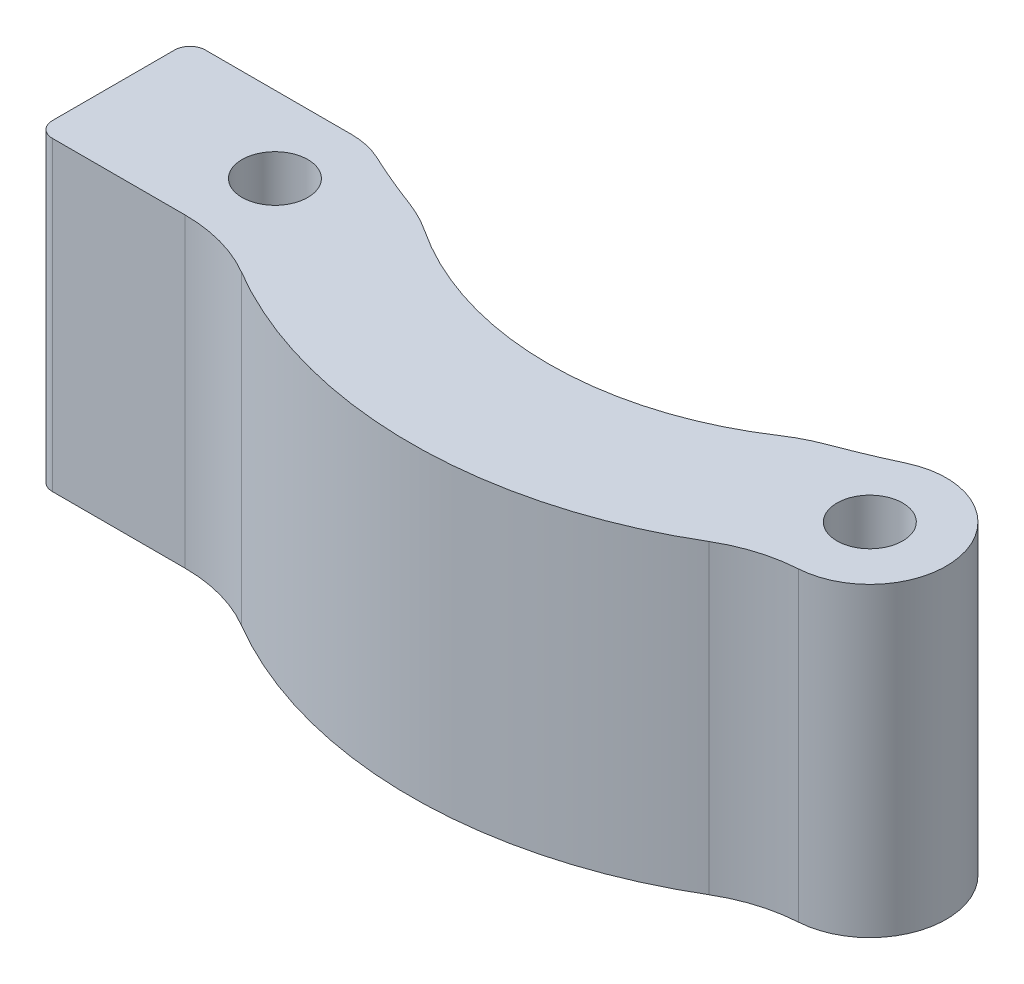
ISO-10303-21;
HEADER;
FILE_DESCRIPTION(('STEP AP214'),'2;1');
FILE_NAME('part.step','',(''),(''),'','','');
FILE_SCHEMA(('AUTOMOTIVE_DESIGN { 1 0 10303 214 1 1 1 1 }'));
ENDSEC;
DATA;
#1=APPLICATION_CONTEXT('core data for automotive mechanical design processes');
#2=APPLICATION_PROTOCOL_DEFINITION('international standard','automotive_design',2000,#1);
#3=PRODUCT_CONTEXT('',#1,'mechanical');
#4=PRODUCT('Part','Part','',(#3));
#5=PRODUCT_RELATED_PRODUCT_CATEGORY('part','',(#4));
#6=PRODUCT_DEFINITION_FORMATION('','',#4);
#7=PRODUCT_DEFINITION_CONTEXT('part definition',#1,'design');
#8=PRODUCT_DEFINITION('design','',#6,#7);
#9=PRODUCT_DEFINITION_SHAPE('','',#8);
#10=(LENGTH_UNIT() NAMED_UNIT(*) SI_UNIT(.MILLI.,.METRE.));
#11=(NAMED_UNIT(*) PLANE_ANGLE_UNIT() SI_UNIT($,.RADIAN.));
#12=(NAMED_UNIT(*) SI_UNIT($,.STERADIAN.) SOLID_ANGLE_UNIT());
#13=UNCERTAINTY_MEASURE_WITH_UNIT(LENGTH_MEASURE(1.E-05),#10,'distance_accuracy_value','');
#14=(GEOMETRIC_REPRESENTATION_CONTEXT(3) GLOBAL_UNCERTAINTY_ASSIGNED_CONTEXT((#13)) GLOBAL_UNIT_ASSIGNED_CONTEXT((#10,
#11,#12)) REPRESENTATION_CONTEXT('',''));
#15=CARTESIAN_POINT('',(0.,0.,0.));
#16=DIRECTION('',(0.,0.,1.));
#17=DIRECTION('',(1.,0.,0.));
#18=AXIS2_PLACEMENT_3D('',#15,#16,#17);
#19=CARTESIAN_POINT('',(-19.4454364826302,20.,19.44543648263));
#20=DIRECTION('',(0.,1.,0.));
#21=DIRECTION('',(0.,0.,1.));
#22=AXIS2_PLACEMENT_3D('',#19,#20,#21);
#23=PLANE('',#22);
#24=CARTESIAN_POINT('',(-19.4454364826302,20.,19.44543648263));
#25=DIRECTION('',(0.,1.,0.));
#26=DIRECTION('',(0.,0.,1.));
#27=AXIS2_PLACEMENT_3D('',#24,#25,#26);
#28=CIRCLE('',#27,2.15);
#29=CARTESIAN_POINT('',(-19.4454364826302,20.,21.5954364826299));
#30=VERTEX_POINT('',#29);
#31=EDGE_CURVE('E168',#30,#30,#28,.T.);
#32=ORIENTED_EDGE('',*,*,#31,.F.);
#33=EDGE_LOOP('',(#32));
#34=FACE_BOUND('',#33,.T.);
#35=DIRECTION('',(0.,0.,1.));
#36=VECTOR('',#35,1.);
#37=CARTESIAN_POINT('',(-30.,20.,14.44543648263));
#38=LINE('',#37,#36);
#39=CARTESIAN_POINT('',(-30.,20.,15.44543648263));
#40=VERTEX_POINT('',#39);
#41=CARTESIAN_POINT('',(-30.,20.,23.44543648263));
#42=VERTEX_POINT('',#41);
#43=EDGE_CURVE('E181',#40,#42,#38,.T.);
#44=ORIENTED_EDGE('',*,*,#43,.T.);
#45=CARTESIAN_POINT('',(-29.,20.,23.44543648263));
#46=DIRECTION('',(0.,1.,0.));
#47=DIRECTION('',(0.,0.,1.));
#48=AXIS2_PLACEMENT_3D('',#45,#46,#47);
#49=CIRCLE('',#48,1.);
#50=CARTESIAN_POINT('',(-29.,20.,24.44543648263));
#51=VERTEX_POINT('',#50);
#52=EDGE_CURVE('E40',#42,#51,#49,.T.);
#53=ORIENTED_EDGE('',*,*,#52,.T.);
#54=DIRECTION('',(1.,0.,0.));
#55=VECTOR('',#54,1.);
#56=CARTESIAN_POINT('',(-30.,20.,24.44543648263));
#57=LINE('',#56,#55);
#58=CARTESIAN_POINT('',(-20.334992144604,20.,24.44543648263));
#59=VERTEX_POINT('',#58);
#60=EDGE_CURVE('E246',#51,#59,#57,.T.);
#61=ORIENTED_EDGE('',*,*,#60,.T.);
#62=CARTESIAN_POINT('',(-20.334992144604,20.,34.44543648263));
#63=DIRECTION('',(0.,1.,0.));
#64=DIRECTION('',(0.,0.,1.));
#65=AXIS2_PLACEMENT_3D('',#62,#63,#64);
#66=CIRCLE('',#65,10.);
#67=CARTESIAN_POINT('',(-15.251244108453,20.,25.8340773619725));
#68=VERTEX_POINT('',#67);
#69=EDGE_CURVE('E214',#59,#68,#66,.F.);
#70=ORIENTED_EDGE('',*,*,#69,.T.);
#71=CARTESIAN_POINT('',(0.,20.,0.));
#72=DIRECTION('',(0.,1.,0.));
#73=DIRECTION('',(0.,0.,1.));
#74=AXIS2_PLACEMENT_3D('',#71,#72,#73);
#75=CIRCLE('',#74,30.);
#76=CARTESIAN_POINT('',(15.2885851280833,20.,25.8119965283848));
#77=VERTEX_POINT('',#76);
#78=EDGE_CURVE('E254',#68,#77,#75,.T.);
#79=ORIENTED_EDGE('',*,*,#78,.T.);
#80=CARTESIAN_POINT('',(20.3847801707778,20.,34.4159953711797));
#81=DIRECTION('',(0.,1.,0.));
#82=DIRECTION('',(0.,0.,1.));
#83=AXIS2_PLACEMENT_3D('',#80,#81,#82);
#84=CIRCLE('',#83,10.);
#85=CARTESIAN_POINT('',(19.758551045346,20.,24.4356227788132));
#86=VERTEX_POINT('',#85);
#87=EDGE_CURVE('E209',#77,#86,#84,.F.);
#88=ORIENTED_EDGE('',*,*,#87,.T.);
#89=CARTESIAN_POINT('',(19.4454364826302,20.,19.44543648263));
#90=DIRECTION('',(0.,1.,0.));
#91=DIRECTION('',(0.,0.,-1.));
#92=AXIS2_PLACEMENT_3D('',#89,#90,#91);
#93=CIRCLE('',#92,5.);
#94=CARTESIAN_POINT('',(17.3265439472029,20.,14.9166072273686));
#95=VERTEX_POINT('',#94);
#96=EDGE_CURVE('E341',#86,#95,#93,.T.);
#97=ORIENTED_EDGE('',*,*,#96,.T.);
#98=CARTESIAN_POINT('',(-3.86238140706937,20.,-30.3716853252445));
#99=DIRECTION('',(0.,1.,0.));
#100=DIRECTION('',(0.,0.,1.));
#101=AXIS2_PLACEMENT_3D('',#98,#99,#100);
#102=CIRCLE('',#101,50.);
#103=CARTESIAN_POINT('',(13.6344348460901,20.,16.4669890902764));
#104=VERTEX_POINT('',#103);
#105=EDGE_CURVE('E227',#95,#104,#102,.F.);
#106=ORIENTED_EDGE('',*,*,#105,.T.);
#107=CARTESIAN_POINT('',(17.133798096722,20.,25.8347239733806));
#108=DIRECTION('',(0.,1.,0.));
#109=DIRECTION('',(0.,0.,1.));
#110=AXIS2_PLACEMENT_3D('',#107,#108,#109);
#111=CIRCLE('',#110,10.);
#112=CARTESIAN_POINT('',(11.6067664526181,20.,17.5009420464836));
#113=VERTEX_POINT('',#112);
#114=EDGE_CURVE('E203',#104,#113,#111,.T.);
#115=ORIENTED_EDGE('',*,*,#114,.T.);
#116=CARTESIAN_POINT('',(0.,20.,0.));
#117=DIRECTION('',(0.,-1.,0.));
#118=DIRECTION('',(0.,0.,1.));
#119=AXIS2_PLACEMENT_3D('',#116,#117,#118);
#120=CIRCLE('',#119,21.);
#121=CARTESIAN_POINT('',(-11.6067664526181,20.,17.5009420464836));
#122=VERTEX_POINT('',#121);
#123=EDGE_CURVE('E151',#113,#122,#120,.T.);
#124=ORIENTED_EDGE('',*,*,#123,.T.);
#125=CARTESIAN_POINT('',(-17.133798096722,20.,25.8347239733806));
#126=DIRECTION('',(0.,1.,0.));
#127=DIRECTION('',(0.,0.,1.));
#128=AXIS2_PLACEMENT_3D('',#125,#126,#127);
#129=CIRCLE('',#128,10.);
#130=CARTESIAN_POINT('',(-13.6344348460901,20.,16.4669890902764));
#131=VERTEX_POINT('',#130);
#132=EDGE_CURVE('E205',#122,#131,#129,.T.);
#133=ORIENTED_EDGE('',*,*,#132,.T.);
#134=CARTESIAN_POINT('',(3.86238140706935,20.,-30.3716853252445));
#135=DIRECTION('',(0.,1.,0.));
#136=DIRECTION('',(0.,0.,1.));
#137=AXIS2_PLACEMENT_3D('',#134,#135,#136);
#138=CIRCLE('',#137,50.);
#139=CARTESIAN_POINT('',(-17.3265439472029,20.,14.9166072273686));
#140=VERTEX_POINT('',#139);
#141=EDGE_CURVE('E147',#131,#140,#138,.F.);
#142=ORIENTED_EDGE('',*,*,#141,.T.);
#143=CARTESIAN_POINT('',(-19.4454364826302,20.,19.44543648263));
#144=DIRECTION('',(0.,1.,0.));
#145=DIRECTION('',(0.,0.,1.));
#146=AXIS2_PLACEMENT_3D('',#143,#144,#145);
#147=CIRCLE('',#146,5.);
#148=CARTESIAN_POINT('',(-19.4454364826302,20.,14.44543648263));
#149=VERTEX_POINT('',#148);
#150=EDGE_CURVE('E140',#140,#149,#147,.T.);
#151=ORIENTED_EDGE('',*,*,#150,.T.);
#152=DIRECTION('',(-1.,0.,0.));
#153=VECTOR('',#152,1.);
#154=CARTESIAN_POINT('',(-19.4454364826302,20.,14.44543648263));
#155=LINE('',#154,#153);
#156=CARTESIAN_POINT('',(-29.,20.,14.44543648263));
#157=VERTEX_POINT('',#156);
#158=EDGE_CURVE('E143',#149,#157,#155,.T.);
#159=ORIENTED_EDGE('',*,*,#158,.T.);
#160=CARTESIAN_POINT('',(-29.,20.,15.44543648263));
#161=DIRECTION('',(0.,1.,0.));
#162=DIRECTION('',(0.,0.,1.));
#163=AXIS2_PLACEMENT_3D('',#160,#161,#162);
#164=CIRCLE('',#163,1.);
#165=EDGE_CURVE('E243',#157,#40,#164,.T.);
#166=ORIENTED_EDGE('',*,*,#165,.T.);
#167=EDGE_LOOP('',(#44,#53,#61,#70,#79,#88,#97,#106,#115,#124,#133,#142,#151,#159,#166));
#168=FACE_BOUND('',#167,.T.);
#169=CARTESIAN_POINT('',(19.4454364826302,20.,19.44543648263));
#170=DIRECTION('',(0.,1.,0.));
#171=DIRECTION('',(0.,0.,-1.));
#172=AXIS2_PLACEMENT_3D('',#169,#170,#171);
#173=CIRCLE('',#172,2.15);
#174=CARTESIAN_POINT('',(19.4454364826302,20.,17.29543648263));
#175=VERTEX_POINT('',#174);
#176=EDGE_CURVE('E355',#175,#175,#173,.T.);
#177=ORIENTED_EDGE('',*,*,#176,.F.);
#178=EDGE_LOOP('',(#177));
#179=FACE_BOUND('',#178,.T.);
#180=ADVANCED_FACE('F32',(#34,#168,#179),#23,.T.);
#181=CARTESIAN_POINT('',(-19.4454364826302,0.,19.44543648263));
#182=DIRECTION('',(0.,1.,0.));
#183=DIRECTION('',(0.,0.,1.));
#184=AXIS2_PLACEMENT_3D('',#181,#182,#183);
#185=PLANE('',#184);
#186=DIRECTION('',(1.,0.,0.));
#187=VECTOR('',#186,1.);
#188=CARTESIAN_POINT('',(-30.,0.,24.44543648263));
#189=LINE('',#188,#187);
#190=CARTESIAN_POINT('',(-29.,0.,24.44543648263));
#191=VERTEX_POINT('',#190);
#192=CARTESIAN_POINT('',(-20.334992144604,0.,24.44543648263));
#193=VERTEX_POINT('',#192);
#194=EDGE_CURVE('E167',#191,#193,#189,.T.);
#195=ORIENTED_EDGE('',*,*,#194,.F.);
#196=CARTESIAN_POINT('',(-29.,0.,23.44543648263));
#197=DIRECTION('',(0.,1.,0.));
#198=DIRECTION('',(0.,0.,1.));
#199=AXIS2_PLACEMENT_3D('',#196,#197,#198);
#200=CIRCLE('',#199,1.);
#201=CARTESIAN_POINT('',(-30.,0.,23.44543648263));
#202=VERTEX_POINT('',#201);
#203=EDGE_CURVE('E237',#191,#202,#200,.F.);
#204=ORIENTED_EDGE('',*,*,#203,.T.);
#205=DIRECTION('',(0.,0.,1.));
#206=VECTOR('',#205,1.);
#207=CARTESIAN_POINT('',(-30.,0.,14.44543648263));
#208=LINE('',#207,#206);
#209=CARTESIAN_POINT('',(-30.,0.,15.44543648263));
#210=VERTEX_POINT('',#209);
#211=EDGE_CURVE('E165',#210,#202,#208,.T.);
#212=ORIENTED_EDGE('',*,*,#211,.F.);
#213=CARTESIAN_POINT('',(-29.,0.,15.44543648263));
#214=DIRECTION('',(0.,1.,0.));
#215=DIRECTION('',(0.,0.,1.));
#216=AXIS2_PLACEMENT_3D('',#213,#214,#215);
#217=CIRCLE('',#216,1.);
#218=CARTESIAN_POINT('',(-29.,0.,14.44543648263));
#219=VERTEX_POINT('',#218);
#220=EDGE_CURVE('E235',#210,#219,#217,.F.);
#221=ORIENTED_EDGE('',*,*,#220,.T.);
#222=DIRECTION('',(-1.,0.,0.));
#223=VECTOR('',#222,1.);
#224=CARTESIAN_POINT('',(-19.4454364826302,0.,14.44543648263));
#225=LINE('',#224,#223);
#226=CARTESIAN_POINT('',(-19.4454364826302,0.,14.44543648263));
#227=VERTEX_POINT('',#226);
#228=EDGE_CURVE('E180',#227,#219,#225,.T.);
#229=ORIENTED_EDGE('',*,*,#228,.F.);
#230=CARTESIAN_POINT('',(-19.4454364826302,0.,19.44543648263));
#231=DIRECTION('',(0.,1.,0.));
#232=DIRECTION('',(0.,0.,1.));
#233=AXIS2_PLACEMENT_3D('',#230,#231,#232);
#234=CIRCLE('',#233,5.);
#235=CARTESIAN_POINT('',(-17.3265439472029,0.,14.9166072273686));
#236=VERTEX_POINT('',#235);
#237=EDGE_CURVE('E157',#236,#227,#234,.T.);
#238=ORIENTED_EDGE('',*,*,#237,.F.);
#239=CARTESIAN_POINT('',(3.86238140706935,0.,-30.3716853252445));
#240=DIRECTION('',(0.,1.,0.));
#241=DIRECTION('',(0.,0.,1.));
#242=AXIS2_PLACEMENT_3D('',#239,#240,#241);
#243=CIRCLE('',#242,50.);
#244=CARTESIAN_POINT('',(-13.6344348460901,0.,16.4669890902764));
#245=VERTEX_POINT('',#244);
#246=EDGE_CURVE('E229',#236,#245,#243,.T.);
#247=ORIENTED_EDGE('',*,*,#246,.T.);
#248=CARTESIAN_POINT('',(-17.133798096722,0.,25.8347239733806));
#249=DIRECTION('',(0.,1.,0.));
#250=DIRECTION('',(0.,0.,1.));
#251=AXIS2_PLACEMENT_3D('',#248,#249,#250);
#252=CIRCLE('',#251,10.);
#253=CARTESIAN_POINT('',(-11.6067664526181,0.,17.5009420464836));
#254=VERTEX_POINT('',#253);
#255=EDGE_CURVE('E196',#245,#254,#252,.F.);
#256=ORIENTED_EDGE('',*,*,#255,.T.);
#257=CARTESIAN_POINT('',(0.,0.,0.));
#258=DIRECTION('',(0.,-1.,0.));
#259=DIRECTION('',(0.,0.,1.));
#260=AXIS2_PLACEMENT_3D('',#257,#258,#259);
#261=CIRCLE('',#260,21.);
#262=CARTESIAN_POINT('',(11.6067664526181,0.,17.5009420464836));
#263=VERTEX_POINT('',#262);
#264=EDGE_CURVE('E176',#263,#254,#261,.T.);
#265=ORIENTED_EDGE('',*,*,#264,.F.);
#266=CARTESIAN_POINT('',(17.133798096722,0.,25.8347239733806));
#267=DIRECTION('',(0.,1.,0.));
#268=DIRECTION('',(0.,0.,1.));
#269=AXIS2_PLACEMENT_3D('',#266,#267,#268);
#270=CIRCLE('',#269,10.);
#271=CARTESIAN_POINT('',(13.6344348460901,0.,16.4669890902764));
#272=VERTEX_POINT('',#271);
#273=EDGE_CURVE('E193',#263,#272,#270,.F.);
#274=ORIENTED_EDGE('',*,*,#273,.T.);
#275=CARTESIAN_POINT('',(-3.86238140706937,0.,-30.3716853252445));
#276=DIRECTION('',(0.,1.,0.));
#277=DIRECTION('',(0.,0.,1.));
#278=AXIS2_PLACEMENT_3D('',#275,#276,#277);
#279=CIRCLE('',#278,50.);
#280=CARTESIAN_POINT('',(17.3265439472029,0.,14.9166072273686));
#281=VERTEX_POINT('',#280);
#282=EDGE_CURVE('E225',#272,#281,#279,.T.);
#283=ORIENTED_EDGE('',*,*,#282,.T.);
#284=CARTESIAN_POINT('',(19.4454364826302,0.,19.44543648263));
#285=DIRECTION('',(0.,1.,0.));
#286=DIRECTION('',(0.,0.,-1.));
#287=AXIS2_PLACEMENT_3D('',#284,#285,#286);
#288=CIRCLE('',#287,5.);
#289=CARTESIAN_POINT('',(19.758551045346,0.,24.4356227788132));
#290=VERTEX_POINT('',#289);
#291=EDGE_CURVE('E173',#290,#281,#288,.T.);
#292=ORIENTED_EDGE('',*,*,#291,.F.);
#293=CARTESIAN_POINT('',(20.3847801707778,0.,34.4159953711797));
#294=DIRECTION('',(0.,1.,0.));
#295=DIRECTION('',(0.,0.,1.));
#296=AXIS2_PLACEMENT_3D('',#293,#294,#295);
#297=CIRCLE('',#296,10.);
#298=CARTESIAN_POINT('',(15.2885851280833,0.,25.8119965283848));
#299=VERTEX_POINT('',#298);
#300=EDGE_CURVE('E207',#290,#299,#297,.T.);
#301=ORIENTED_EDGE('',*,*,#300,.T.);
#302=CARTESIAN_POINT('',(0.,0.,0.));
#303=DIRECTION('',(0.,1.,0.));
#304=DIRECTION('',(0.,0.,1.));
#305=AXIS2_PLACEMENT_3D('',#302,#303,#304);
#306=CIRCLE('',#305,30.);
#307=CARTESIAN_POINT('',(-15.251244108453,0.,25.8340773619725));
#308=VERTEX_POINT('',#307);
#309=EDGE_CURVE('E170',#308,#299,#306,.T.);
#310=ORIENTED_EDGE('',*,*,#309,.F.);
#311=CARTESIAN_POINT('',(-20.334992144604,0.,34.44543648263));
#312=DIRECTION('',(0.,1.,0.));
#313=DIRECTION('',(0.,0.,1.));
#314=AXIS2_PLACEMENT_3D('',#311,#312,#313);
#315=CIRCLE('',#314,10.);
#316=EDGE_CURVE('E211',#308,#193,#315,.T.);
#317=ORIENTED_EDGE('',*,*,#316,.T.);
#318=EDGE_LOOP('',(#195,#204,#212,#221,#229,#238,#247,#256,#265,#274,#283,#292,#301,#310,#317));
#319=FACE_BOUND('',#318,.T.);
#320=CARTESIAN_POINT('',(-19.4454364826302,0.,19.44543648263));
#321=DIRECTION('',(0.,1.,0.));
#322=DIRECTION('',(0.,0.,1.));
#323=AXIS2_PLACEMENT_3D('',#320,#321,#322);
#324=CIRCLE('',#323,2.15);
#325=CARTESIAN_POINT('',(-19.4454364826302,0.,21.5954364826299));
#326=VERTEX_POINT('',#325);
#327=EDGE_CURVE('E352',#326,#326,#324,.T.);
#328=ORIENTED_EDGE('',*,*,#327,.T.);
#329=EDGE_LOOP('',(#328));
#330=FACE_BOUND('',#329,.T.);
#331=CARTESIAN_POINT('',(19.4454364826302,0.,19.44543648263));
#332=DIRECTION('',(0.,1.,0.));
#333=DIRECTION('',(0.,0.,-1.));
#334=AXIS2_PLACEMENT_3D('',#331,#332,#333);
#335=CIRCLE('',#334,2.15);
#336=CARTESIAN_POINT('',(19.4454364826302,0.,17.29543648263));
#337=VERTEX_POINT('',#336);
#338=EDGE_CURVE('E358',#337,#337,#335,.T.);
#339=ORIENTED_EDGE('',*,*,#338,.T.);
#340=EDGE_LOOP('',(#339));
#341=FACE_BOUND('',#340,.T.);
#342=ADVANCED_FACE('F259',(#319,#330,#341),#185,.F.);
#343=CARTESIAN_POINT('',(-30.,20.,14.44543648263));
#344=DIRECTION('',(1.,0.,0.));
#345=DIRECTION('',(0.,0.,-1.));
#346=AXIS2_PLACEMENT_3D('',#343,#344,#345);
#347=PLANE('',#346);
#348=ORIENTED_EDGE('',*,*,#211,.T.);
#349=DIRECTION('',(0.,-1.,0.));
#350=VECTOR('',#349,1.);
#351=CARTESIAN_POINT('',(-30.,20.,23.44543648263));
#352=LINE('',#351,#350);
#353=EDGE_CURVE('E53',#202,#42,#352,.F.);
#354=ORIENTED_EDGE('',*,*,#353,.T.);
#355=ORIENTED_EDGE('',*,*,#43,.F.);
#356=DIRECTION('',(0.,-1.,0.));
#357=VECTOR('',#356,1.);
#358=CARTESIAN_POINT('',(-30.,20.,15.44543648263));
#359=LINE('',#358,#357);
#360=EDGE_CURVE('E239',#40,#210,#359,.T.);
#361=ORIENTED_EDGE('',*,*,#360,.T.);
#362=EDGE_LOOP('',(#348,#354,#355,#361));
#363=FACE_BOUND('',#362,.T.);
#364=ADVANCED_FACE('F261',(#363),#347,.F.);
#365=CARTESIAN_POINT('',(-30.,20.,24.44543648263));
#366=DIRECTION('',(0.,0.,-1.));
#367=DIRECTION('',(-1.,0.,0.));
#368=AXIS2_PLACEMENT_3D('',#365,#366,#367);
#369=PLANE('',#368);
#370=ORIENTED_EDGE('',*,*,#60,.F.);
#371=DIRECTION('',(0.,-1.,0.));
#372=VECTOR('',#371,1.);
#373=CARTESIAN_POINT('',(-29.,20.,24.44543648263));
#374=LINE('',#373,#372);
#375=EDGE_CURVE('E232',#51,#191,#374,.T.);
#376=ORIENTED_EDGE('',*,*,#375,.T.);
#377=ORIENTED_EDGE('',*,*,#194,.T.);
#378=DIRECTION('',(0.,1.,0.));
#379=VECTOR('',#378,1.);
#380=CARTESIAN_POINT('',(-20.334992144604,20.,24.44543648263));
#381=LINE('',#380,#379);
#382=EDGE_CURVE('E190',#193,#59,#381,.T.);
#383=ORIENTED_EDGE('',*,*,#382,.T.);
#384=EDGE_LOOP('',(#370,#376,#377,#383));
#385=FACE_BOUND('',#384,.T.);
#386=ADVANCED_FACE('F250',(#385),#369,.F.);
#387=CARTESIAN_POINT('',(0.,20.,0.));
#388=DIRECTION('',(0.,-1.,0.));
#389=DIRECTION('',(0.,0.,-1.));
#390=AXIS2_PLACEMENT_3D('',#387,#388,#389);
#391=CYLINDRICAL_SURFACE('',#390,30.);
#392=ORIENTED_EDGE('',*,*,#309,.T.);
#393=DIRECTION('',(0.,-1.,0.));
#394=VECTOR('',#393,1.);
#395=CARTESIAN_POINT('',(15.2885851280833,20.,25.8119965283848));
#396=LINE('',#395,#394);
#397=EDGE_CURVE('E188',#299,#77,#396,.F.);
#398=ORIENTED_EDGE('',*,*,#397,.T.);
#399=ORIENTED_EDGE('',*,*,#78,.F.);
#400=DIRECTION('',(0.,-1.,0.));
#401=VECTOR('',#400,1.);
#402=CARTESIAN_POINT('',(-15.251244108453,20.,25.8340773619725));
#403=LINE('',#402,#401);
#404=EDGE_CURVE('E185',#68,#308,#403,.T.);
#405=ORIENTED_EDGE('',*,*,#404,.T.);
#406=EDGE_LOOP('',(#392,#398,#399,#405));
#407=FACE_BOUND('',#406,.T.);
#408=ADVANCED_FACE('F306',(#407),#391,.T.);
#409=CARTESIAN_POINT('',(19.4454364826302,20.,19.44543648263));
#410=DIRECTION('',(0.,-1.,0.));
#411=DIRECTION('',(0.,0.,-1.));
#412=AXIS2_PLACEMENT_3D('',#409,#410,#411);
#413=CYLINDRICAL_SURFACE('',#412,5.);
#414=ORIENTED_EDGE('',*,*,#291,.T.);
#415=DIRECTION('',(0.,-1.,0.));
#416=VECTOR('',#415,1.);
#417=CARTESIAN_POINT('',(17.3265439472029,20.,14.9166072273686));
#418=LINE('',#417,#416);
#419=EDGE_CURVE('E219',#281,#95,#418,.F.);
#420=ORIENTED_EDGE('',*,*,#419,.T.);
#421=ORIENTED_EDGE('',*,*,#96,.F.);
#422=DIRECTION('',(0.,-1.,0.));
#423=VECTOR('',#422,1.);
#424=CARTESIAN_POINT('',(19.758551045346,20.,24.4356227788132));
#425=LINE('',#424,#423);
#426=EDGE_CURVE('E159',#86,#290,#425,.T.);
#427=ORIENTED_EDGE('',*,*,#426,.T.);
#428=EDGE_LOOP('',(#414,#420,#421,#427));
#429=FACE_BOUND('',#428,.T.);
#430=ADVANCED_FACE('F302',(#429),#413,.T.);
#431=CARTESIAN_POINT('',(0.,20.,0.));
#432=DIRECTION('',(0.,-1.,0.));
#433=DIRECTION('',(0.,0.,-1.));
#434=AXIS2_PLACEMENT_3D('',#431,#432,#433);
#435=CYLINDRICAL_SURFACE('',#434,21.);
#436=ORIENTED_EDGE('',*,*,#264,.T.);
#437=DIRECTION('',(0.,-1.,0.));
#438=VECTOR('',#437,1.);
#439=CARTESIAN_POINT('',(-11.6067664526181,20.,17.5009420464836));
#440=LINE('',#439,#438);
#441=EDGE_CURVE('E201',#254,#122,#440,.F.);
#442=ORIENTED_EDGE('',*,*,#441,.T.);
#443=ORIENTED_EDGE('',*,*,#123,.F.);
#444=DIRECTION('',(0.,-1.,0.));
#445=VECTOR('',#444,1.);
#446=CARTESIAN_POINT('',(11.6067664526181,20.,17.5009420464836));
#447=LINE('',#446,#445);
#448=EDGE_CURVE('E198',#113,#263,#447,.T.);
#449=ORIENTED_EDGE('',*,*,#448,.T.);
#450=EDGE_LOOP('',(#436,#442,#443,#449));
#451=FACE_BOUND('',#450,.T.);
#452=ADVANCED_FACE('F299',(#451),#435,.F.);
#453=CARTESIAN_POINT('',(-19.4454364826302,20.,19.44543648263));
#454=DIRECTION('',(0.,-1.,0.));
#455=DIRECTION('',(0.,0.,-1.));
#456=AXIS2_PLACEMENT_3D('',#453,#454,#455);
#457=CYLINDRICAL_SURFACE('',#456,5.);
#458=ORIENTED_EDGE('',*,*,#150,.F.);
#459=DIRECTION('',(0.,-1.,0.));
#460=VECTOR('',#459,1.);
#461=CARTESIAN_POINT('',(-17.3265439472029,20.,14.9166072273686));
#462=LINE('',#461,#460);
#463=EDGE_CURVE('E221',#140,#236,#462,.T.);
#464=ORIENTED_EDGE('',*,*,#463,.T.);
#465=ORIENTED_EDGE('',*,*,#237,.T.);
#466=DIRECTION('',(0.,-1.,0.));
#467=VECTOR('',#466,1.);
#468=CARTESIAN_POINT('',(-19.4454364826302,20.,14.44543648263));
#469=LINE('',#468,#467);
#470=EDGE_CURVE('E154',#149,#227,#469,.T.);
#471=ORIENTED_EDGE('',*,*,#470,.F.);
#472=EDGE_LOOP('',(#458,#464,#465,#471));
#473=FACE_BOUND('',#472,.T.);
#474=ADVANCED_FACE('F155',(#473),#457,.T.);
#475=CARTESIAN_POINT('',(-19.4454364826302,20.,14.44543648263));
#476=DIRECTION('',(0.,0.,1.));
#477=DIRECTION('',(1.,0.,0.));
#478=AXIS2_PLACEMENT_3D('',#475,#476,#477);
#479=PLANE('',#478);
#480=ORIENTED_EDGE('',*,*,#228,.T.);
#481=DIRECTION('',(0.,-1.,0.));
#482=VECTOR('',#481,1.);
#483=CARTESIAN_POINT('',(-29.,20.,14.44543648263));
#484=LINE('',#483,#482);
#485=EDGE_CURVE('E11',#219,#157,#484,.F.);
#486=ORIENTED_EDGE('',*,*,#485,.T.);
#487=ORIENTED_EDGE('',*,*,#158,.F.);
#488=ORIENTED_EDGE('',*,*,#470,.T.);
#489=EDGE_LOOP('',(#480,#486,#487,#488));
#490=FACE_BOUND('',#489,.T.);
#491=ADVANCED_FACE('F161',(#490),#479,.F.);
#492=CARTESIAN_POINT('',(-19.4454364826302,20.,19.44543648263));
#493=DIRECTION('',(0.,-1.,0.));
#494=DIRECTION('',(0.,0.,-1.));
#495=AXIS2_PLACEMENT_3D('',#492,#493,#494);
#496=CYLINDRICAL_SURFACE('',#495,2.15);
#497=ORIENTED_EDGE('',*,*,#31,.T.);
#498=EDGE_LOOP('',(#497));
#499=FACE_BOUND('',#498,.T.);
#500=ORIENTED_EDGE('',*,*,#327,.F.);
#501=EDGE_LOOP('',(#500));
#502=FACE_BOUND('',#501,.T.);
#503=ADVANCED_FACE('F292',(#499,#502),#496,.F.);
#504=CARTESIAN_POINT('',(19.4454364826302,20.,19.44543648263));
#505=DIRECTION('',(0.,-1.,0.));
#506=DIRECTION('',(0.,0.,-1.));
#507=AXIS2_PLACEMENT_3D('',#504,#505,#506);
#508=CYLINDRICAL_SURFACE('',#507,2.15);
#509=ORIENTED_EDGE('',*,*,#176,.T.);
#510=EDGE_LOOP('',(#509));
#511=FACE_BOUND('',#510,.T.);
#512=ORIENTED_EDGE('',*,*,#338,.F.);
#513=EDGE_LOOP('',(#512));
#514=FACE_BOUND('',#513,.T.);
#515=ADVANCED_FACE('F319',(#511,#514),#508,.F.);
#516=CARTESIAN_POINT('',(20.3847801707778,20.,34.4159953711797));
#517=DIRECTION('',(0.,1.,0.));
#518=DIRECTION('',(0.,0.,1.));
#519=AXIS2_PLACEMENT_3D('',#516,#517,#518);
#520=CYLINDRICAL_SURFACE('',#519,10.);
#521=ORIENTED_EDGE('',*,*,#87,.F.);
#522=ORIENTED_EDGE('',*,*,#397,.F.);
#523=ORIENTED_EDGE('',*,*,#300,.F.);
#524=ORIENTED_EDGE('',*,*,#426,.F.);
#525=EDGE_LOOP('',(#521,#522,#523,#524));
#526=FACE_BOUND('',#525,.T.);
#527=ADVANCED_FACE('F315',(#526),#520,.F.);
#528=CARTESIAN_POINT('',(-20.334992144604,20.,34.44543648263));
#529=DIRECTION('',(0.,-1.,0.));
#530=DIRECTION('',(0.,0.,-1.));
#531=AXIS2_PLACEMENT_3D('',#528,#529,#530);
#532=CYLINDRICAL_SURFACE('',#531,10.);
#533=ORIENTED_EDGE('',*,*,#69,.F.);
#534=ORIENTED_EDGE('',*,*,#382,.F.);
#535=ORIENTED_EDGE('',*,*,#316,.F.);
#536=ORIENTED_EDGE('',*,*,#404,.F.);
#537=EDGE_LOOP('',(#533,#534,#535,#536));
#538=FACE_BOUND('',#537,.T.);
#539=ADVANCED_FACE('F318',(#538),#532,.F.);
#540=CARTESIAN_POINT('',(-17.133798096722,20.,25.8347239733806));
#541=DIRECTION('',(0.,-1.,0.));
#542=DIRECTION('',(0.,0.,-1.));
#543=AXIS2_PLACEMENT_3D('',#540,#541,#542);
#544=CYLINDRICAL_SURFACE('',#543,10.);
#545=ORIENTED_EDGE('',*,*,#255,.F.);
#546=DIRECTION('',(0.,-1.,0.));
#547=VECTOR('',#546,1.);
#548=CARTESIAN_POINT('',(-13.6344348460901,20.,16.4669890902764));
#549=LINE('',#548,#547);
#550=EDGE_CURVE('E223',#245,#131,#549,.F.);
#551=ORIENTED_EDGE('',*,*,#550,.T.);
#552=ORIENTED_EDGE('',*,*,#132,.F.);
#553=ORIENTED_EDGE('',*,*,#441,.F.);
#554=EDGE_LOOP('',(#545,#551,#552,#553));
#555=FACE_BOUND('',#554,.T.);
#556=ADVANCED_FACE('F270',(#555),#544,.T.);
#557=CARTESIAN_POINT('',(17.133798096722,20.,25.8347239733806));
#558=DIRECTION('',(0.,-1.,0.));
#559=DIRECTION('',(0.,0.,-1.));
#560=AXIS2_PLACEMENT_3D('',#557,#558,#559);
#561=CYLINDRICAL_SURFACE('',#560,10.);
#562=ORIENTED_EDGE('',*,*,#114,.F.);
#563=DIRECTION('',(0.,-1.,0.));
#564=VECTOR('',#563,1.);
#565=CARTESIAN_POINT('',(13.6344348460901,20.,16.4669890902764));
#566=LINE('',#565,#564);
#567=EDGE_CURVE('E216',#104,#272,#566,.T.);
#568=ORIENTED_EDGE('',*,*,#567,.T.);
#569=ORIENTED_EDGE('',*,*,#273,.F.);
#570=ORIENTED_EDGE('',*,*,#448,.F.);
#571=EDGE_LOOP('',(#562,#568,#569,#570));
#572=FACE_BOUND('',#571,.T.);
#573=ADVANCED_FACE('F280',(#572),#561,.T.);
#574=CARTESIAN_POINT('',(-3.86238140706937,20.,-30.3716853252445));
#575=DIRECTION('',(0.,1.,0.));
#576=DIRECTION('',(0.,0.,1.));
#577=AXIS2_PLACEMENT_3D('',#574,#575,#576);
#578=CYLINDRICAL_SURFACE('',#577,50.);
#579=ORIENTED_EDGE('',*,*,#105,.F.);
#580=ORIENTED_EDGE('',*,*,#419,.F.);
#581=ORIENTED_EDGE('',*,*,#282,.F.);
#582=ORIENTED_EDGE('',*,*,#567,.F.);
#583=EDGE_LOOP('',(#579,#580,#581,#582));
#584=FACE_BOUND('',#583,.T.);
#585=ADVANCED_FACE('F274',(#584),#578,.F.);
#586=CARTESIAN_POINT('',(3.86238140706935,20.,-30.3716853252445));
#587=DIRECTION('',(0.,1.,0.));
#588=DIRECTION('',(0.,0.,1.));
#589=AXIS2_PLACEMENT_3D('',#586,#587,#588);
#590=CYLINDRICAL_SURFACE('',#589,50.);
#591=ORIENTED_EDGE('',*,*,#141,.F.);
#592=ORIENTED_EDGE('',*,*,#550,.F.);
#593=ORIENTED_EDGE('',*,*,#246,.F.);
#594=ORIENTED_EDGE('',*,*,#463,.F.);
#595=EDGE_LOOP('',(#591,#592,#593,#594));
#596=FACE_BOUND('',#595,.T.);
#597=ADVANCED_FACE('F272',(#596),#590,.F.);
#598=CARTESIAN_POINT('',(-29.,20.,23.44543648263));
#599=DIRECTION('',(0.,-1.,0.));
#600=DIRECTION('',(0.,0.,-1.));
#601=AXIS2_PLACEMENT_3D('',#598,#599,#600);
#602=CYLINDRICAL_SURFACE('',#601,1.);
#603=ORIENTED_EDGE('',*,*,#52,.F.);
#604=ORIENTED_EDGE('',*,*,#353,.F.);
#605=ORIENTED_EDGE('',*,*,#203,.F.);
#606=ORIENTED_EDGE('',*,*,#375,.F.);
#607=EDGE_LOOP('',(#603,#604,#605,#606));
#608=FACE_BOUND('',#607,.T.);
#609=ADVANCED_FACE('F256',(#608),#602,.T.);
#610=CARTESIAN_POINT('',(-29.,20.,15.44543648263));
#611=DIRECTION('',(0.,-1.,0.));
#612=DIRECTION('',(0.,0.,-1.));
#613=AXIS2_PLACEMENT_3D('',#610,#611,#612);
#614=CYLINDRICAL_SURFACE('',#613,1.);
#615=ORIENTED_EDGE('',*,*,#165,.F.);
#616=ORIENTED_EDGE('',*,*,#485,.F.);
#617=ORIENTED_EDGE('',*,*,#220,.F.);
#618=ORIENTED_EDGE('',*,*,#360,.F.);
#619=EDGE_LOOP('',(#615,#616,#617,#618));
#620=FACE_BOUND('',#619,.T.);
#621=ADVANCED_FACE('F34',(#620),#614,.T.);
#622=CLOSED_SHELL('',(#180,#342,#364,#386,#408,#430,#452,#474,#491,#503,#515,#527,#539,#556,
#573,#585,#597,#609,#621));
#623=MANIFOLD_SOLID_BREP('B2',#622);
#624=ADVANCED_BREP_SHAPE_REPRESENTATION('',(#18,#623),#14);
#625=SHAPE_DEFINITION_REPRESENTATION(#9,#624);
ENDSEC;
END-ISO-10303-21;
